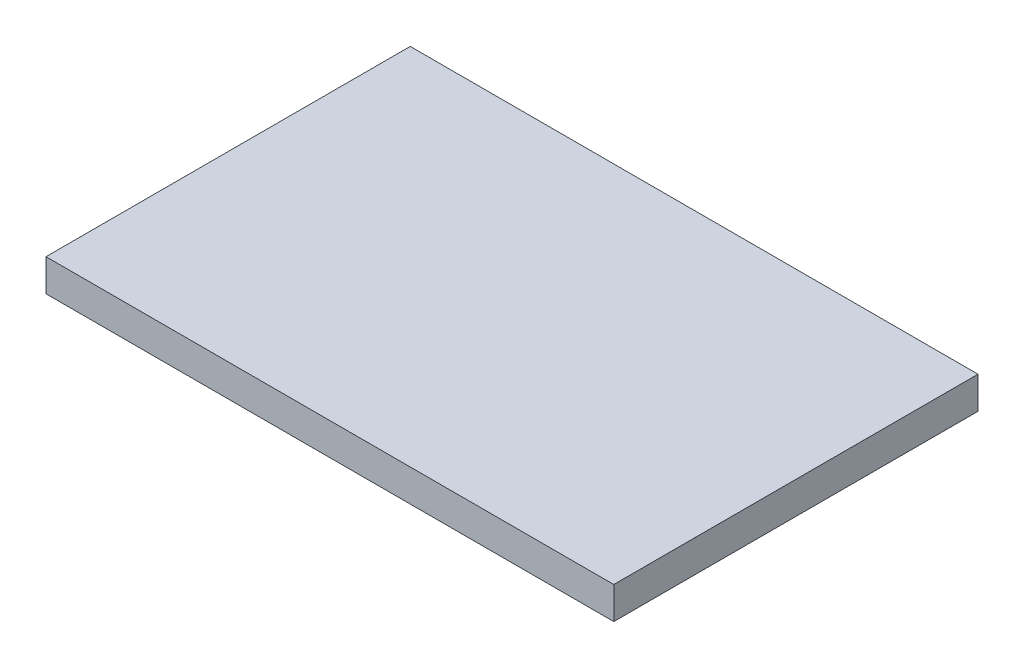
ISO-10303-21;
HEADER;
FILE_DESCRIPTION(('STEP AP214'),'2;1');
FILE_NAME('part.step','',(''),(''),'','','');
FILE_SCHEMA(('AUTOMOTIVE_DESIGN { 1 0 10303 214 1 1 1 1 }'));
ENDSEC;
DATA;
#1=APPLICATION_CONTEXT('core data for automotive mechanical design processes');
#2=APPLICATION_PROTOCOL_DEFINITION('international standard','automotive_design',2000,#1);
#3=PRODUCT_CONTEXT('',#1,'mechanical');
#4=PRODUCT('Part','Part','',(#3));
#5=PRODUCT_RELATED_PRODUCT_CATEGORY('part','',(#4));
#6=PRODUCT_DEFINITION_FORMATION('','',#4);
#7=PRODUCT_DEFINITION_CONTEXT('part definition',#1,'design');
#8=PRODUCT_DEFINITION('design','',#6,#7);
#9=PRODUCT_DEFINITION_SHAPE('','',#8);
#10=(LENGTH_UNIT() NAMED_UNIT(*) SI_UNIT(.MILLI.,.METRE.));
#11=(NAMED_UNIT(*) PLANE_ANGLE_UNIT() SI_UNIT($,.RADIAN.));
#12=(NAMED_UNIT(*) SI_UNIT($,.STERADIAN.) SOLID_ANGLE_UNIT());
#13=UNCERTAINTY_MEASURE_WITH_UNIT(LENGTH_MEASURE(1.E-05),#10,'distance_accuracy_value','');
#14=(GEOMETRIC_REPRESENTATION_CONTEXT(3) GLOBAL_UNCERTAINTY_ASSIGNED_CONTEXT((#13)) GLOBAL_UNIT_ASSIGNED_CONTEXT((#10,
#11,#12)) REPRESENTATION_CONTEXT('',''));
#15=CARTESIAN_POINT('',(0.,0.,0.));
#16=DIRECTION('',(0.,0.,1.));
#17=DIRECTION('',(1.,0.,0.));
#18=AXIS2_PLACEMENT_3D('',#15,#16,#17);
#19=CARTESIAN_POINT('',(0.,0.,0.));
#20=DIRECTION('',(0.,1.,0.));
#21=DIRECTION('',(0.,0.,1.));
#22=AXIS2_PLACEMENT_3D('',#19,#20,#21);
#23=PLANE('',#22);
#24=DIRECTION('',(-1.,0.,0.));
#25=VECTOR('',#24,1.);
#26=CARTESIAN_POINT('',(-53.,0.,34.));
#27=LINE('',#26,#25);
#28=CARTESIAN_POINT('',(53.,0.,34.));
#29=VERTEX_POINT('',#28);
#30=CARTESIAN_POINT('',(-53.,0.,34.));
#31=VERTEX_POINT('',#30);
#32=EDGE_CURVE('E81',#29,#31,#27,.T.);
#33=ORIENTED_EDGE('',*,*,#32,.T.);
#34=DIRECTION('',(0.,0.,-1.));
#35=VECTOR('',#34,1.);
#36=CARTESIAN_POINT('',(-53.,0.,-34.));
#37=LINE('',#36,#35);
#38=CARTESIAN_POINT('',(-53.,0.,-34.));
#39=VERTEX_POINT('',#38);
#40=EDGE_CURVE('E68',#31,#39,#37,.T.);
#41=ORIENTED_EDGE('',*,*,#40,.T.);
#42=DIRECTION('',(1.,0.,0.));
#43=VECTOR('',#42,1.);
#44=CARTESIAN_POINT('',(-53.,0.,-34.));
#45=LINE('',#44,#43);
#46=CARTESIAN_POINT('',(53.,0.,-34.));
#47=VERTEX_POINT('',#46);
#48=EDGE_CURVE('E55',#39,#47,#45,.T.);
#49=ORIENTED_EDGE('',*,*,#48,.T.);
#50=DIRECTION('',(0.,0.,1.));
#51=VECTOR('',#50,1.);
#52=CARTESIAN_POINT('',(53.,0.,-34.));
#53=LINE('',#52,#51);
#54=EDGE_CURVE('E20',#47,#29,#53,.T.);
#55=ORIENTED_EDGE('',*,*,#54,.T.);
#56=EDGE_LOOP('',(#33,#41,#49,#55));
#57=FACE_BOUND('',#56,.T.);
#58=ADVANCED_FACE('F17',(#57),#23,.F.);
#59=CARTESIAN_POINT('',(53.,6.,-34.));
#60=DIRECTION('',(-1.,0.,0.));
#61=DIRECTION('',(0.,0.,1.));
#62=AXIS2_PLACEMENT_3D('',#59,#60,#61);
#63=PLANE('',#62);
#64=DIRECTION('',(0.,1.,0.));
#65=VECTOR('',#64,1.);
#66=CARTESIAN_POINT('',(53.,6.,-34.));
#67=LINE('',#66,#65);
#68=CARTESIAN_POINT('',(53.,6.,-34.));
#69=VERTEX_POINT('',#68);
#70=EDGE_CURVE('E61',#47,#69,#67,.T.);
#71=ORIENTED_EDGE('',*,*,#70,.T.);
#72=DIRECTION('',(0.,0.,1.));
#73=VECTOR('',#72,1.);
#74=CARTESIAN_POINT('',(53.,6.,0.));
#75=LINE('',#74,#73);
#76=CARTESIAN_POINT('',(53.,6.,34.));
#77=VERTEX_POINT('',#76);
#78=EDGE_CURVE('E83',#77,#69,#75,.F.);
#79=ORIENTED_EDGE('',*,*,#78,.F.);
#80=DIRECTION('',(0.,1.,0.));
#81=VECTOR('',#80,1.);
#82=CARTESIAN_POINT('',(53.,6.,34.));
#83=LINE('',#82,#81);
#84=EDGE_CURVE('E64',#77,#29,#83,.F.);
#85=ORIENTED_EDGE('',*,*,#84,.T.);
#86=ORIENTED_EDGE('',*,*,#54,.F.);
#87=EDGE_LOOP('',(#71,#79,#85,#86));
#88=FACE_BOUND('',#87,.T.);
#89=ADVANCED_FACE('F60',(#88),#63,.F.);
#90=CARTESIAN_POINT('',(-53.,6.,-34.));
#91=DIRECTION('',(0.,0.,1.));
#92=DIRECTION('',(1.,0.,0.));
#93=AXIS2_PLACEMENT_3D('',#90,#91,#92);
#94=PLANE('',#93);
#95=DIRECTION('',(0.,1.,0.));
#96=VECTOR('',#95,1.);
#97=CARTESIAN_POINT('',(-53.,6.,-34.));
#98=LINE('',#97,#96);
#99=CARTESIAN_POINT('',(-53.,6.,-34.));
#100=VERTEX_POINT('',#99);
#101=EDGE_CURVE('E70',#39,#100,#98,.T.);
#102=ORIENTED_EDGE('',*,*,#101,.T.);
#103=DIRECTION('',(1.,0.,0.));
#104=VECTOR('',#103,1.);
#105=CARTESIAN_POINT('',(0.,6.,-34.));
#106=LINE('',#105,#104);
#107=EDGE_CURVE('E74',#69,#100,#106,.F.);
#108=ORIENTED_EDGE('',*,*,#107,.F.);
#109=ORIENTED_EDGE('',*,*,#70,.F.);
#110=ORIENTED_EDGE('',*,*,#48,.F.);
#111=EDGE_LOOP('',(#102,#108,#109,#110));
#112=FACE_BOUND('',#111,.T.);
#113=ADVANCED_FACE('F72',(#112),#94,.F.);
#114=CARTESIAN_POINT('',(-53.,6.,-34.));
#115=DIRECTION('',(1.,0.,0.));
#116=DIRECTION('',(0.,0.,-1.));
#117=AXIS2_PLACEMENT_3D('',#114,#115,#116);
#118=PLANE('',#117);
#119=DIRECTION('',(0.,1.,0.));
#120=VECTOR('',#119,1.);
#121=CARTESIAN_POINT('',(-53.,6.,34.));
#122=LINE('',#121,#120);
#123=CARTESIAN_POINT('',(-53.,6.,34.));
#124=VERTEX_POINT('',#123);
#125=EDGE_CURVE('E35',#31,#124,#122,.T.);
#126=ORIENTED_EDGE('',*,*,#125,.T.);
#127=DIRECTION('',(0.,0.,1.));
#128=VECTOR('',#127,1.);
#129=CARTESIAN_POINT('',(-53.,6.,0.));
#130=LINE('',#129,#128);
#131=EDGE_CURVE('E26',#100,#124,#130,.T.);
#132=ORIENTED_EDGE('',*,*,#131,.F.);
#133=ORIENTED_EDGE('',*,*,#101,.F.);
#134=ORIENTED_EDGE('',*,*,#40,.F.);
#135=EDGE_LOOP('',(#126,#132,#133,#134));
#136=FACE_BOUND('',#135,.T.);
#137=ADVANCED_FACE('F89',(#136),#118,.F.);
#138=CARTESIAN_POINT('',(-53.,6.,34.));
#139=DIRECTION('',(0.,0.,-1.));
#140=DIRECTION('',(-1.,0.,0.));
#141=AXIS2_PLACEMENT_3D('',#138,#139,#140);
#142=PLANE('',#141);
#143=ORIENTED_EDGE('',*,*,#84,.F.);
#144=DIRECTION('',(1.,0.,0.));
#145=VECTOR('',#144,1.);
#146=CARTESIAN_POINT('',(0.,6.,34.));
#147=LINE('',#146,#145);
#148=EDGE_CURVE('E11',#124,#77,#147,.T.);
#149=ORIENTED_EDGE('',*,*,#148,.F.);
#150=ORIENTED_EDGE('',*,*,#125,.F.);
#151=ORIENTED_EDGE('',*,*,#32,.F.);
#152=EDGE_LOOP('',(#143,#149,#150,#151));
#153=FACE_BOUND('',#152,.T.);
#154=ADVANCED_FACE('F91',(#153),#142,.F.);
#155=CARTESIAN_POINT('',(0.,6.,0.));
#156=DIRECTION('',(0.,1.,0.));
#157=DIRECTION('',(0.,0.,1.));
#158=AXIS2_PLACEMENT_3D('',#155,#156,#157);
#159=PLANE('',#158);
#160=ORIENTED_EDGE('',*,*,#131,.T.);
#161=ORIENTED_EDGE('',*,*,#148,.T.);
#162=ORIENTED_EDGE('',*,*,#78,.T.);
#163=ORIENTED_EDGE('',*,*,#107,.T.);
#164=EDGE_LOOP('',(#160,#161,#162,#163));
#165=FACE_BOUND('',#164,.T.);
#166=ADVANCED_FACE('F88',(#165),#159,.T.);
#167=CLOSED_SHELL('',(#58,#89,#113,#137,#154,#166));
#168=MANIFOLD_SOLID_BREP('B1',#167);
#169=ADVANCED_BREP_SHAPE_REPRESENTATION('',(#18,#168),#14);
#170=SHAPE_DEFINITION_REPRESENTATION(#9,#169);
ENDSEC;
END-ISO-10303-21;
